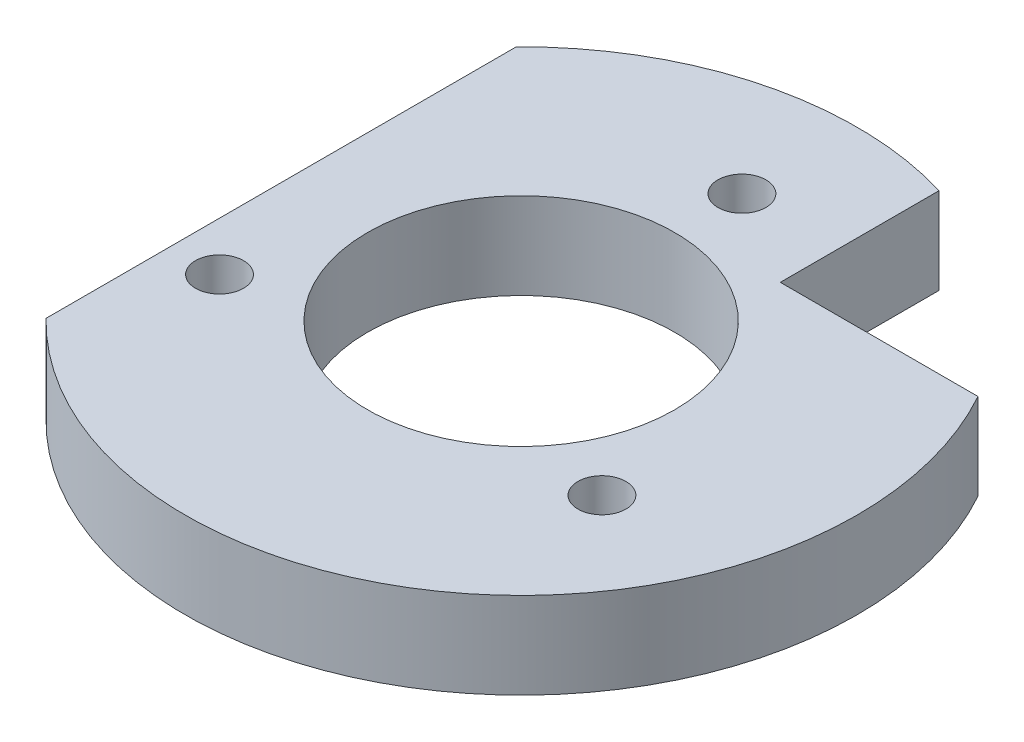
ISO-10303-21;
HEADER;
FILE_DESCRIPTION(('STEP AP214'),'2;1');
FILE_NAME('part.step','',(''),(''),'','','');
FILE_SCHEMA(('AUTOMOTIVE_DESIGN { 1 0 10303 214 1 1 1 1 }'));
ENDSEC;
DATA;
#1=APPLICATION_CONTEXT('core data for automotive mechanical design processes');
#2=APPLICATION_PROTOCOL_DEFINITION('international standard','automotive_design',2000,#1);
#3=PRODUCT_CONTEXT('',#1,'mechanical');
#4=PRODUCT('Part','Part','',(#3));
#5=PRODUCT_RELATED_PRODUCT_CATEGORY('part','',(#4));
#6=PRODUCT_DEFINITION_FORMATION('','',#4);
#7=PRODUCT_DEFINITION_CONTEXT('part definition',#1,'design');
#8=PRODUCT_DEFINITION('design','',#6,#7);
#9=PRODUCT_DEFINITION_SHAPE('','',#8);
#10=(LENGTH_UNIT() NAMED_UNIT(*) SI_UNIT(.MILLI.,.METRE.));
#11=(NAMED_UNIT(*) PLANE_ANGLE_UNIT() SI_UNIT($,.RADIAN.));
#12=(NAMED_UNIT(*) SI_UNIT($,.STERADIAN.) SOLID_ANGLE_UNIT());
#13=UNCERTAINTY_MEASURE_WITH_UNIT(LENGTH_MEASURE(1.E-05),#10,'distance_accuracy_value','');
#14=(GEOMETRIC_REPRESENTATION_CONTEXT(3) GLOBAL_UNCERTAINTY_ASSIGNED_CONTEXT((#13)) GLOBAL_UNIT_ASSIGNED_CONTEXT((#10,
#11,#12)) REPRESENTATION_CONTEXT('',''));
#15=CARTESIAN_POINT('',(0.,0.,0.));
#16=DIRECTION('',(0.,0.,1.));
#17=DIRECTION('',(1.,0.,0.));
#18=AXIS2_PLACEMENT_3D('',#15,#16,#17);
#19=CARTESIAN_POINT('',(0.,0.,0.));
#20=DIRECTION('',(0.,1.,0.));
#21=DIRECTION('',(1.,0.,0.));
#22=AXIS2_PLACEMENT_3D('',#19,#20,#21);
#23=PLANE('',#22);
#24=CARTESIAN_POINT('',(0.,0.,0.));
#25=DIRECTION('',(0.,1.,0.));
#26=DIRECTION('',(0.285714285714302,0.,-0.958314847499905));
#27=AXIS2_PLACEMENT_3D('',#24,#25,#26);
#28=CIRCLE('',#27,17.5);
#29=CARTESIAN_POINT('',(5.,0.,-16.77050983125));
#30=VERTEX_POINT('',#29);
#31=CARTESIAN_POINT('',(-12.5,0.,-12.24744871392));
#32=VERTEX_POINT('',#31);
#33=EDGE_CURVE('E87',#30,#32,#28,.T.);
#34=ORIENTED_EDGE('',*,*,#33,.F.);
#35=DIRECTION('',(0.,0.,-1.));
#36=VECTOR('',#35,1.);
#37=CARTESIAN_POINT('',(5.,0.,-8.5));
#38=LINE('',#37,#36);
#39=CARTESIAN_POINT('',(5.,0.,-8.5));
#40=VERTEX_POINT('',#39);
#41=EDGE_CURVE('E36',#40,#30,#38,.T.);
#42=ORIENTED_EDGE('',*,*,#41,.F.);
#43=DIRECTION('',(-1.,0.,0.));
#44=VECTOR('',#43,1.);
#45=CARTESIAN_POINT('',(15.29705854078,0.,-8.5));
#46=LINE('',#45,#44);
#47=CARTESIAN_POINT('',(15.29705854078,0.,-8.5));
#48=VERTEX_POINT('',#47);
#49=EDGE_CURVE('E99',#48,#40,#46,.T.);
#50=ORIENTED_EDGE('',*,*,#49,.F.);
#51=CARTESIAN_POINT('',(0.,0.,0.));
#52=DIRECTION('',(0.,1.,0.));
#53=DIRECTION('',(-0.71428571428569,0.,0.69985421222379));
#54=AXIS2_PLACEMENT_3D('',#51,#52,#53);
#55=CIRCLE('',#54,17.5);
#56=CARTESIAN_POINT('',(-12.5,0.,12.24744871392));
#57=VERTEX_POINT('',#56);
#58=EDGE_CURVE('E106',#57,#48,#55,.T.);
#59=ORIENTED_EDGE('',*,*,#58,.F.);
#60=DIRECTION('',(0.,0.,1.));
#61=VECTOR('',#60,1.);
#62=CARTESIAN_POINT('',(-12.5,0.,-12.24744871392));
#63=LINE('',#62,#61);
#64=EDGE_CURVE('E89',#32,#57,#63,.T.);
#65=ORIENTED_EDGE('',*,*,#64,.F.);
#66=EDGE_LOOP('',(#34,#42,#50,#59,#65));
#67=FACE_BOUND('',#66,.T.);
#68=CARTESIAN_POINT('',(0.,0.,0.));
#69=DIRECTION('',(0.,-1.,0.));
#70=DIRECTION('',(-1.,0.,0.));
#71=AXIS2_PLACEMENT_3D('',#68,#69,#70);
#72=CIRCLE('',#71,8.);
#73=CARTESIAN_POINT('',(-8.,0.,0.));
#74=VERTEX_POINT('',#73);
#75=EDGE_CURVE('E110',#74,#74,#72,.T.);
#76=ORIENTED_EDGE('',*,*,#75,.F.);
#77=EDGE_LOOP('',(#76));
#78=FACE_BOUND('',#77,.T.);
#79=CARTESIAN_POINT('',(0.,0.,-11.5));
#80=DIRECTION('',(0.,1.,0.));
#81=DIRECTION('',(1.,0.,0.));
#82=AXIS2_PLACEMENT_3D('',#79,#80,#81);
#83=CIRCLE('',#82,1.25);
#84=CARTESIAN_POINT('',(1.25,0.,-11.5));
#85=VERTEX_POINT('',#84);
#86=EDGE_CURVE('E11',#85,#85,#83,.T.);
#87=ORIENTED_EDGE('',*,*,#86,.T.);
#88=EDGE_LOOP('',(#87));
#89=FACE_BOUND('',#88,.T.);
#90=CARTESIAN_POINT('',(-9.959292143521,0.,5.75));
#91=DIRECTION('',(0.,1.,0.));
#92=DIRECTION('',(-0.500000000000017,0.,-0.866025403784429));
#93=AXIS2_PLACEMENT_3D('',#90,#91,#92);
#94=CIRCLE('',#93,1.25);
#95=CARTESIAN_POINT('',(-10.584292143521,0.,4.66746824526946));
#96=VERTEX_POINT('',#95);
#97=EDGE_CURVE('E27',#96,#96,#94,.T.);
#98=ORIENTED_EDGE('',*,*,#97,.T.);
#99=EDGE_LOOP('',(#98));
#100=FACE_BOUND('',#99,.T.);
#101=CARTESIAN_POINT('',(9.959292143521,0.,5.75));
#102=DIRECTION('',(0.,1.,0.));
#103=DIRECTION('',(-0.500000000000017,0.,0.866025403784429));
#104=AXIS2_PLACEMENT_3D('',#101,#102,#103);
#105=CIRCLE('',#104,1.25);
#106=CARTESIAN_POINT('',(9.33429214352098,0.,6.83253175473054));
#107=VERTEX_POINT('',#106);
#108=EDGE_CURVE('E112',#107,#107,#105,.T.);
#109=ORIENTED_EDGE('',*,*,#108,.T.);
#110=EDGE_LOOP('',(#109));
#111=FACE_BOUND('',#110,.T.);
#112=ADVANCED_FACE('F17',(#67,#78,#89,#100,#111),#23,.F.);
#113=CARTESIAN_POINT('',(0.,0.,0.));
#114=DIRECTION('',(0.,1.,0.));
#115=DIRECTION('',(1.,0.,0.));
#116=AXIS2_PLACEMENT_3D('',#113,#114,#115);
#117=CYLINDRICAL_SURFACE('',#116,8.);
#118=CARTESIAN_POINT('',(0.,4.5,0.));
#119=DIRECTION('',(0.,-1.,0.));
#120=DIRECTION('',(1.,0.,0.));
#121=AXIS2_PLACEMENT_3D('',#118,#119,#120);
#122=CIRCLE('',#121,8.);
#123=CARTESIAN_POINT('',(8.,4.5,0.));
#124=VERTEX_POINT('',#123);
#125=EDGE_CURVE('E79',#124,#124,#122,.T.);
#126=ORIENTED_EDGE('',*,*,#125,.F.);
#127=EDGE_LOOP('',(#126));
#128=FACE_BOUND('',#127,.T.);
#129=ORIENTED_EDGE('',*,*,#75,.T.);
#130=EDGE_LOOP('',(#129));
#131=FACE_BOUND('',#130,.T.);
#132=ADVANCED_FACE('F136',(#128,#131),#117,.F.);
#133=CARTESIAN_POINT('',(0.,4.5,0.));
#134=DIRECTION('',(0.,1.,0.));
#135=DIRECTION('',(1.,0.,0.));
#136=AXIS2_PLACEMENT_3D('',#133,#134,#135);
#137=PLANE('',#136);
#138=CARTESIAN_POINT('',(0.,4.5,0.));
#139=DIRECTION('',(0.,1.,0.));
#140=DIRECTION('',(-0.71428571428569,0.,0.69985421222379));
#141=AXIS2_PLACEMENT_3D('',#138,#139,#140);
#142=CIRCLE('',#141,17.5);
#143=CARTESIAN_POINT('',(-12.5,4.5,12.24744871392));
#144=VERTEX_POINT('',#143);
#145=CARTESIAN_POINT('',(15.29705854078,4.5,-8.5));
#146=VERTEX_POINT('',#145);
#147=EDGE_CURVE('E113',#144,#146,#142,.T.);
#148=ORIENTED_EDGE('',*,*,#147,.T.);
#149=DIRECTION('',(-1.,0.,0.));
#150=VECTOR('',#149,1.);
#151=CARTESIAN_POINT('',(15.29705854078,4.5,-8.5));
#152=LINE('',#151,#150);
#153=CARTESIAN_POINT('',(5.,4.5,-8.5));
#154=VERTEX_POINT('',#153);
#155=EDGE_CURVE('E122',#146,#154,#152,.T.);
#156=ORIENTED_EDGE('',*,*,#155,.T.);
#157=DIRECTION('',(0.,0.,-1.));
#158=VECTOR('',#157,1.);
#159=CARTESIAN_POINT('',(5.,4.5,-8.5));
#160=LINE('',#159,#158);
#161=CARTESIAN_POINT('',(5.,4.5,-16.77050983125));
#162=VERTEX_POINT('',#161);
#163=EDGE_CURVE('E84',#154,#162,#160,.T.);
#164=ORIENTED_EDGE('',*,*,#163,.T.);
#165=CARTESIAN_POINT('',(0.,4.5,0.));
#166=DIRECTION('',(0.,1.,0.));
#167=DIRECTION('',(0.285714285714302,0.,-0.958314847499905));
#168=AXIS2_PLACEMENT_3D('',#165,#166,#167);
#169=CIRCLE('',#168,17.5);
#170=CARTESIAN_POINT('',(-12.5,4.5,-12.24744871392));
#171=VERTEX_POINT('',#170);
#172=EDGE_CURVE('E64',#162,#171,#169,.T.);
#173=ORIENTED_EDGE('',*,*,#172,.T.);
#174=DIRECTION('',(0.,0.,1.));
#175=VECTOR('',#174,1.);
#176=CARTESIAN_POINT('',(-12.5,4.5,-12.24744871392));
#177=LINE('',#176,#175);
#178=EDGE_CURVE('E70',#171,#144,#177,.T.);
#179=ORIENTED_EDGE('',*,*,#178,.T.);
#180=EDGE_LOOP('',(#148,#156,#164,#173,#179));
#181=FACE_BOUND('',#180,.T.);
#182=ORIENTED_EDGE('',*,*,#125,.T.);
#183=EDGE_LOOP('',(#182));
#184=FACE_BOUND('',#183,.T.);
#185=CARTESIAN_POINT('',(0.,4.5,-11.5));
#186=DIRECTION('',(0.,1.,0.));
#187=DIRECTION('',(1.,0.,0.));
#188=AXIS2_PLACEMENT_3D('',#185,#186,#187);
#189=CIRCLE('',#188,1.25);
#190=CARTESIAN_POINT('',(1.25,4.5,-11.5));
#191=VERTEX_POINT('',#190);
#192=EDGE_CURVE('E108',#191,#191,#189,.T.);
#193=ORIENTED_EDGE('',*,*,#192,.F.);
#194=EDGE_LOOP('',(#193));
#195=FACE_BOUND('',#194,.T.);
#196=CARTESIAN_POINT('',(-9.959292143521,4.5,5.75));
#197=DIRECTION('',(0.,1.,0.));
#198=DIRECTION('',(-0.500000000000017,0.,-0.866025403784429));
#199=AXIS2_PLACEMENT_3D('',#196,#197,#198);
#200=CIRCLE('',#199,1.25);
#201=CARTESIAN_POINT('',(-10.584292143521,4.5,4.66746824526946));
#202=VERTEX_POINT('',#201);
#203=EDGE_CURVE('E127',#202,#202,#200,.T.);
#204=ORIENTED_EDGE('',*,*,#203,.F.);
#205=EDGE_LOOP('',(#204));
#206=FACE_BOUND('',#205,.T.);
#207=CARTESIAN_POINT('',(9.959292143521,4.5,5.75));
#208=DIRECTION('',(0.,1.,0.));
#209=DIRECTION('',(-0.500000000000017,0.,0.866025403784429));
#210=AXIS2_PLACEMENT_3D('',#207,#208,#209);
#211=CIRCLE('',#210,1.25);
#212=CARTESIAN_POINT('',(9.33429214352098,4.5,6.83253175473054));
#213=VERTEX_POINT('',#212);
#214=EDGE_CURVE('E129',#213,#213,#211,.T.);
#215=ORIENTED_EDGE('',*,*,#214,.F.);
#216=EDGE_LOOP('',(#215));
#217=FACE_BOUND('',#216,.T.);
#218=ADVANCED_FACE('F81',(#181,#184,#195,#206,#217),#137,.T.);
#219=CARTESIAN_POINT('',(-12.5,0.,-12.24744871392));
#220=DIRECTION('',(-1.,0.,0.));
#221=DIRECTION('',(0.,0.,1.));
#222=AXIS2_PLACEMENT_3D('',#219,#220,#221);
#223=PLANE('',#222);
#224=DIRECTION('',(0.,1.,0.));
#225=VECTOR('',#224,1.);
#226=CARTESIAN_POINT('',(-12.5,0.,12.24744871392));
#227=LINE('',#226,#225);
#228=EDGE_CURVE('E75',#57,#144,#227,.T.);
#229=ORIENTED_EDGE('',*,*,#228,.T.);
#230=ORIENTED_EDGE('',*,*,#178,.F.);
#231=DIRECTION('',(0.,1.,0.));
#232=VECTOR('',#231,1.);
#233=CARTESIAN_POINT('',(-12.5,0.,-12.24744871392));
#234=LINE('',#233,#232);
#235=EDGE_CURVE('E73',#32,#171,#234,.T.);
#236=ORIENTED_EDGE('',*,*,#235,.F.);
#237=ORIENTED_EDGE('',*,*,#64,.T.);
#238=EDGE_LOOP('',(#229,#230,#236,#237));
#239=FACE_BOUND('',#238,.T.);
#240=ADVANCED_FACE('F71',(#239),#223,.T.);
#241=CARTESIAN_POINT('',(0.,0.,0.));
#242=DIRECTION('',(0.,1.,0.));
#243=DIRECTION('',(1.,0.,0.));
#244=AXIS2_PLACEMENT_3D('',#241,#242,#243);
#245=CYLINDRICAL_SURFACE('',#244,17.5);
#246=ORIENTED_EDGE('',*,*,#235,.T.);
#247=ORIENTED_EDGE('',*,*,#172,.F.);
#248=DIRECTION('',(0.,1.,0.));
#249=VECTOR('',#248,1.);
#250=CARTESIAN_POINT('',(5.,0.,-16.77050983125));
#251=LINE('',#250,#249);
#252=EDGE_CURVE('E92',#30,#162,#251,.T.);
#253=ORIENTED_EDGE('',*,*,#252,.F.);
#254=ORIENTED_EDGE('',*,*,#33,.T.);
#255=EDGE_LOOP('',(#246,#247,#253,#254));
#256=FACE_BOUND('',#255,.T.);
#257=ADVANCED_FACE('F86',(#256),#245,.T.);
#258=CARTESIAN_POINT('',(5.,0.,-8.5));
#259=DIRECTION('',(1.,0.,0.));
#260=DIRECTION('',(0.,0.,-1.));
#261=AXIS2_PLACEMENT_3D('',#258,#259,#260);
#262=PLANE('',#261);
#263=ORIENTED_EDGE('',*,*,#252,.T.);
#264=ORIENTED_EDGE('',*,*,#163,.F.);
#265=DIRECTION('',(0.,1.,0.));
#266=VECTOR('',#265,1.);
#267=CARTESIAN_POINT('',(5.,0.,-8.5));
#268=LINE('',#267,#266);
#269=EDGE_CURVE('E97',#40,#154,#268,.T.);
#270=ORIENTED_EDGE('',*,*,#269,.F.);
#271=ORIENTED_EDGE('',*,*,#41,.T.);
#272=EDGE_LOOP('',(#263,#264,#270,#271));
#273=FACE_BOUND('',#272,.T.);
#274=ADVANCED_FACE('F180',(#273),#262,.T.);
#275=CARTESIAN_POINT('',(15.29705854078,0.,-8.5));
#276=DIRECTION('',(0.,0.,-1.));
#277=DIRECTION('',(-1.,0.,0.));
#278=AXIS2_PLACEMENT_3D('',#275,#276,#277);
#279=PLANE('',#278);
#280=ORIENTED_EDGE('',*,*,#269,.T.);
#281=ORIENTED_EDGE('',*,*,#155,.F.);
#282=DIRECTION('',(0.,1.,0.));
#283=VECTOR('',#282,1.);
#284=CARTESIAN_POINT('',(15.29705854078,0.,-8.5));
#285=LINE('',#284,#283);
#286=EDGE_CURVE('E21',#48,#146,#285,.T.);
#287=ORIENTED_EDGE('',*,*,#286,.F.);
#288=ORIENTED_EDGE('',*,*,#49,.T.);
#289=EDGE_LOOP('',(#280,#281,#287,#288));
#290=FACE_BOUND('',#289,.T.);
#291=ADVANCED_FACE('F176',(#290),#279,.T.);
#292=CARTESIAN_POINT('',(0.,0.,0.));
#293=DIRECTION('',(0.,1.,0.));
#294=DIRECTION('',(1.,0.,0.));
#295=AXIS2_PLACEMENT_3D('',#292,#293,#294);
#296=CYLINDRICAL_SURFACE('',#295,17.5);
#297=ORIENTED_EDGE('',*,*,#286,.T.);
#298=ORIENTED_EDGE('',*,*,#147,.F.);
#299=ORIENTED_EDGE('',*,*,#228,.F.);
#300=ORIENTED_EDGE('',*,*,#58,.T.);
#301=EDGE_LOOP('',(#297,#298,#299,#300));
#302=FACE_BOUND('',#301,.T.);
#303=ADVANCED_FACE('F169',(#302),#296,.T.);
#304=CARTESIAN_POINT('',(0.,0.,-11.5));
#305=DIRECTION('',(0.,1.,0.));
#306=DIRECTION('',(-1.,0.,0.));
#307=AXIS2_PLACEMENT_3D('',#304,#305,#306);
#308=CYLINDRICAL_SURFACE('',#307,1.25);
#309=ORIENTED_EDGE('',*,*,#192,.T.);
#310=EDGE_LOOP('',(#309));
#311=FACE_BOUND('',#310,.T.);
#312=ORIENTED_EDGE('',*,*,#86,.F.);
#313=EDGE_LOOP('',(#312));
#314=FACE_BOUND('',#313,.T.);
#315=ADVANCED_FACE('F164',(#311,#314),#308,.F.);
#316=CARTESIAN_POINT('',(-9.959292143521,0.,5.75));
#317=DIRECTION('',(0.,1.,0.));
#318=DIRECTION('',(0.500000000000017,0.,0.866025403784429));
#319=AXIS2_PLACEMENT_3D('',#316,#317,#318);
#320=CYLINDRICAL_SURFACE('',#319,1.25);
#321=ORIENTED_EDGE('',*,*,#203,.T.);
#322=EDGE_LOOP('',(#321));
#323=FACE_BOUND('',#322,.T.);
#324=ORIENTED_EDGE('',*,*,#97,.F.);
#325=EDGE_LOOP('',(#324));
#326=FACE_BOUND('',#325,.T.);
#327=ADVANCED_FACE('F160',(#323,#326),#320,.F.);
#328=CARTESIAN_POINT('',(9.959292143521,0.,5.75));
#329=DIRECTION('',(0.,1.,0.));
#330=DIRECTION('',(0.500000000000017,0.,-0.866025403784429));
#331=AXIS2_PLACEMENT_3D('',#328,#329,#330);
#332=CYLINDRICAL_SURFACE('',#331,1.25);
#333=ORIENTED_EDGE('',*,*,#214,.T.);
#334=EDGE_LOOP('',(#333));
#335=FACE_BOUND('',#334,.T.);
#336=ORIENTED_EDGE('',*,*,#108,.F.);
#337=EDGE_LOOP('',(#336));
#338=FACE_BOUND('',#337,.T.);
#339=ADVANCED_FACE('F19',(#335,#338),#332,.F.);
#340=CLOSED_SHELL('',(#112,#132,#218,#240,#257,#274,#291,#303,#315,#327,#339));
#341=MANIFOLD_SOLID_BREP('B1',#340);
#342=ADVANCED_BREP_SHAPE_REPRESENTATION('',(#18,#341),#14);
#343=SHAPE_DEFINITION_REPRESENTATION(#9,#342);
ENDSEC;
END-ISO-10303-21;
